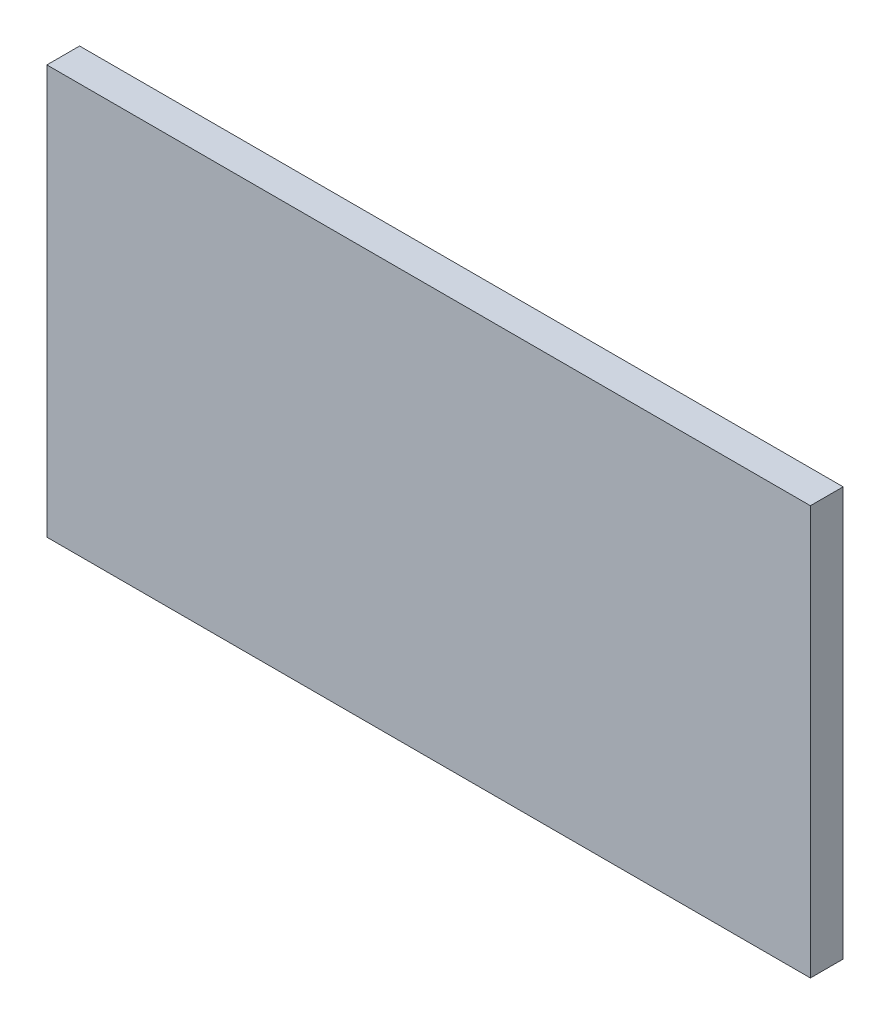
ISO-10303-21;
HEADER;
FILE_DESCRIPTION(('STEP AP214'),'2;1');
FILE_NAME('part.step','',(''),(''),'','','');
FILE_SCHEMA(('AUTOMOTIVE_DESIGN { 1 0 10303 214 1 1 1 1 }'));
ENDSEC;
DATA;
#1=APPLICATION_CONTEXT('core data for automotive mechanical design processes');
#2=APPLICATION_PROTOCOL_DEFINITION('international standard','automotive_design',2000,#1);
#3=PRODUCT_CONTEXT('',#1,'mechanical');
#4=PRODUCT('Part','Part','',(#3));
#5=PRODUCT_RELATED_PRODUCT_CATEGORY('part','',(#4));
#6=PRODUCT_DEFINITION_FORMATION('','',#4);
#7=PRODUCT_DEFINITION_CONTEXT('part definition',#1,'design');
#8=PRODUCT_DEFINITION('design','',#6,#7);
#9=PRODUCT_DEFINITION_SHAPE('','',#8);
#10=(LENGTH_UNIT() NAMED_UNIT(*) SI_UNIT(.MILLI.,.METRE.));
#11=(NAMED_UNIT(*) PLANE_ANGLE_UNIT() SI_UNIT($,.RADIAN.));
#12=(NAMED_UNIT(*) SI_UNIT($,.STERADIAN.) SOLID_ANGLE_UNIT());
#13=UNCERTAINTY_MEASURE_WITH_UNIT(LENGTH_MEASURE(1.E-05),#10,'distance_accuracy_value','');
#14=(GEOMETRIC_REPRESENTATION_CONTEXT(3) GLOBAL_UNCERTAINTY_ASSIGNED_CONTEXT((#13)) GLOBAL_UNIT_ASSIGNED_CONTEXT((#10,
#11,#12)) REPRESENTATION_CONTEXT('',''));
#15=CARTESIAN_POINT('',(0.,0.,0.));
#16=DIRECTION('',(0.,0.,1.));
#17=DIRECTION('',(1.,0.,0.));
#18=AXIS2_PLACEMENT_3D('',#15,#16,#17);
#19=CARTESIAN_POINT('',(-14.0000000000002,-7.49999999999994,1.2));
#20=DIRECTION('',(0.,0.,1.));
#21=DIRECTION('',(1.,0.,0.));
#22=AXIS2_PLACEMENT_3D('',#19,#20,#21);
#23=PLANE('',#22);
#24=DIRECTION('',(0.,1.,0.));
#25=VECTOR('',#24,1.);
#26=CARTESIAN_POINT('',(-13.9999999999998,7.50000000000006,1.2));
#27=LINE('',#26,#25);
#28=CARTESIAN_POINT('',(-13.9999999999998,7.50000000000006,1.2));
#29=VERTEX_POINT('',#28);
#30=CARTESIAN_POINT('',(-14.0000000000001,-7.49999999999994,1.2));
#31=VERTEX_POINT('',#30);
#32=EDGE_CURVE('E20',#29,#31,#27,.F.);
#33=ORIENTED_EDGE('',*,*,#32,.T.);
#34=DIRECTION('',(1.,0.,0.));
#35=VECTOR('',#34,1.);
#36=CARTESIAN_POINT('',(-14.0000000000002,-7.49999999999994,1.2));
#37=LINE('',#36,#35);
#38=CARTESIAN_POINT('',(13.9999999999998,-7.49999999999994,1.2));
#39=VERTEX_POINT('',#38);
#40=EDGE_CURVE('E55',#31,#39,#37,.T.);
#41=ORIENTED_EDGE('',*,*,#40,.T.);
#42=DIRECTION('',(0.,-1.,0.));
#43=VECTOR('',#42,1.);
#44=CARTESIAN_POINT('',(13.9999999999998,7.50000000000006,1.2));
#45=LINE('',#44,#43);
#46=CARTESIAN_POINT('',(13.9999999999998,7.50000000000006,1.2));
#47=VERTEX_POINT('',#46);
#48=EDGE_CURVE('E76',#39,#47,#45,.F.);
#49=ORIENTED_EDGE('',*,*,#48,.T.);
#50=DIRECTION('',(1.,0.,0.));
#51=VECTOR('',#50,1.);
#52=CARTESIAN_POINT('',(-13.9999999999998,7.50000000000006,1.2));
#53=LINE('',#52,#51);
#54=EDGE_CURVE('E58',#47,#29,#53,.F.);
#55=ORIENTED_EDGE('',*,*,#54,.T.);
#56=EDGE_LOOP('',(#33,#41,#49,#55));
#57=FACE_BOUND('',#56,.T.);
#58=ADVANCED_FACE('F17',(#57),#23,.T.);
#59=CARTESIAN_POINT('',(-13.9999999999998,7.50000000000006,1.2));
#60=DIRECTION('',(1.,0.,0.));
#61=DIRECTION('',(0.,1.,0.));
#62=AXIS2_PLACEMENT_3D('',#59,#60,#61);
#63=PLANE('',#62);
#64=ORIENTED_EDGE('',*,*,#32,.F.);
#65=DIRECTION('',(0.,0.,-1.));
#66=VECTOR('',#65,1.);
#67=CARTESIAN_POINT('',(-13.9999999999998,7.50000000000006,1.2));
#68=LINE('',#67,#66);
#69=CARTESIAN_POINT('',(-13.9999999999998,7.50000000000006,0.));
#70=VERTEX_POINT('',#69);
#71=EDGE_CURVE('E80',#29,#70,#68,.T.);
#72=ORIENTED_EDGE('',*,*,#71,.T.);
#73=DIRECTION('',(0.,1.,0.));
#74=VECTOR('',#73,1.);
#75=CARTESIAN_POINT('',(-13.9999999999998,-7.49999999999994,0.));
#76=LINE('',#75,#74);
#77=CARTESIAN_POINT('',(-14.0000000000001,-7.49999999999994,0.));
#78=VERTEX_POINT('',#77);
#79=EDGE_CURVE('E73',#70,#78,#76,.F.);
#80=ORIENTED_EDGE('',*,*,#79,.T.);
#81=DIRECTION('',(0.,0.,1.));
#82=VECTOR('',#81,1.);
#83=CARTESIAN_POINT('',(-14.0000000000001,-7.49999999999994,1.2));
#84=LINE('',#83,#82);
#85=EDGE_CURVE('E63',#78,#31,#84,.T.);
#86=ORIENTED_EDGE('',*,*,#85,.T.);
#87=EDGE_LOOP('',(#64,#72,#80,#86));
#88=FACE_BOUND('',#87,.T.);
#89=ADVANCED_FACE('F72',(#88),#63,.F.);
#90=CARTESIAN_POINT('',(-14.0000000000002,-7.49999999999994,1.2));
#91=DIRECTION('',(0.,1.,0.));
#92=DIRECTION('',(0.,0.,1.));
#93=AXIS2_PLACEMENT_3D('',#90,#91,#92);
#94=PLANE('',#93);
#95=ORIENTED_EDGE('',*,*,#40,.F.);
#96=ORIENTED_EDGE('',*,*,#85,.F.);
#97=DIRECTION('',(1.,0.,0.));
#98=VECTOR('',#97,1.);
#99=CARTESIAN_POINT('',(-14.0000000000002,-7.49999999999994,0.));
#100=LINE('',#99,#98);
#101=CARTESIAN_POINT('',(13.9999999999998,-7.49999999999994,0.));
#102=VERTEX_POINT('',#101);
#103=EDGE_CURVE('E83',#78,#102,#100,.T.);
#104=ORIENTED_EDGE('',*,*,#103,.T.);
#105=DIRECTION('',(0.,0.,1.));
#106=VECTOR('',#105,1.);
#107=CARTESIAN_POINT('',(13.9999999999998,-7.49999999999994,1.2));
#108=LINE('',#107,#106);
#109=EDGE_CURVE('E69',#102,#39,#108,.T.);
#110=ORIENTED_EDGE('',*,*,#109,.T.);
#111=EDGE_LOOP('',(#95,#96,#104,#110));
#112=FACE_BOUND('',#111,.T.);
#113=ADVANCED_FACE('F66',(#112),#94,.F.);
#114=CARTESIAN_POINT('',(13.9999999999998,7.50000000000006,1.2));
#115=DIRECTION('',(-1.,0.,0.));
#116=DIRECTION('',(0.,-1.,0.));
#117=AXIS2_PLACEMENT_3D('',#114,#115,#116);
#118=PLANE('',#117);
#119=ORIENTED_EDGE('',*,*,#48,.F.);
#120=ORIENTED_EDGE('',*,*,#109,.F.);
#121=DIRECTION('',(0.,1.,0.));
#122=VECTOR('',#121,1.);
#123=CARTESIAN_POINT('',(13.9999999999998,-7.49999999999994,0.));
#124=LINE('',#123,#122);
#125=CARTESIAN_POINT('',(13.9999999999998,7.50000000000006,0.));
#126=VERTEX_POINT('',#125);
#127=EDGE_CURVE('E26',#102,#126,#124,.T.);
#128=ORIENTED_EDGE('',*,*,#127,.T.);
#129=DIRECTION('',(0.,0.,-1.));
#130=VECTOR('',#129,1.);
#131=CARTESIAN_POINT('',(13.9999999999998,7.50000000000006,1.2));
#132=LINE('',#131,#130);
#133=EDGE_CURVE('E34',#126,#47,#132,.F.);
#134=ORIENTED_EDGE('',*,*,#133,.T.);
#135=EDGE_LOOP('',(#119,#120,#128,#134));
#136=FACE_BOUND('',#135,.T.);
#137=ADVANCED_FACE('F88',(#136),#118,.F.);
#138=CARTESIAN_POINT('',(-13.9999999999998,7.50000000000006,1.2));
#139=DIRECTION('',(0.,-1.,0.));
#140=DIRECTION('',(0.,0.,-1.));
#141=AXIS2_PLACEMENT_3D('',#138,#139,#140);
#142=PLANE('',#141);
#143=ORIENTED_EDGE('',*,*,#54,.F.);
#144=ORIENTED_EDGE('',*,*,#133,.F.);
#145=DIRECTION('',(1.,0.,0.));
#146=VECTOR('',#145,1.);
#147=CARTESIAN_POINT('',(-14.0000000000002,7.50000000000006,0.));
#148=LINE('',#147,#146);
#149=EDGE_CURVE('E11',#126,#70,#148,.F.);
#150=ORIENTED_EDGE('',*,*,#149,.T.);
#151=ORIENTED_EDGE('',*,*,#71,.F.);
#152=EDGE_LOOP('',(#143,#144,#150,#151));
#153=FACE_BOUND('',#152,.T.);
#154=ADVANCED_FACE('F91',(#153),#142,.F.);
#155=CARTESIAN_POINT('',(-14.0000000000002,-7.49999999999994,0.));
#156=DIRECTION('',(0.,0.,1.));
#157=DIRECTION('',(1.,0.,0.));
#158=AXIS2_PLACEMENT_3D('',#155,#156,#157);
#159=PLANE('',#158);
#160=ORIENTED_EDGE('',*,*,#127,.F.);
#161=ORIENTED_EDGE('',*,*,#103,.F.);
#162=ORIENTED_EDGE('',*,*,#79,.F.);
#163=ORIENTED_EDGE('',*,*,#149,.F.);
#164=EDGE_LOOP('',(#160,#161,#162,#163));
#165=FACE_BOUND('',#164,.T.);
#166=ADVANCED_FACE('F90',(#165),#159,.F.);
#167=CLOSED_SHELL('',(#58,#89,#113,#137,#154,#166));
#168=MANIFOLD_SOLID_BREP('B1',#167);
#169=ADVANCED_BREP_SHAPE_REPRESENTATION('',(#18,#168),#14);
#170=SHAPE_DEFINITION_REPRESENTATION(#9,#169);
ENDSEC;
END-ISO-10303-21;
